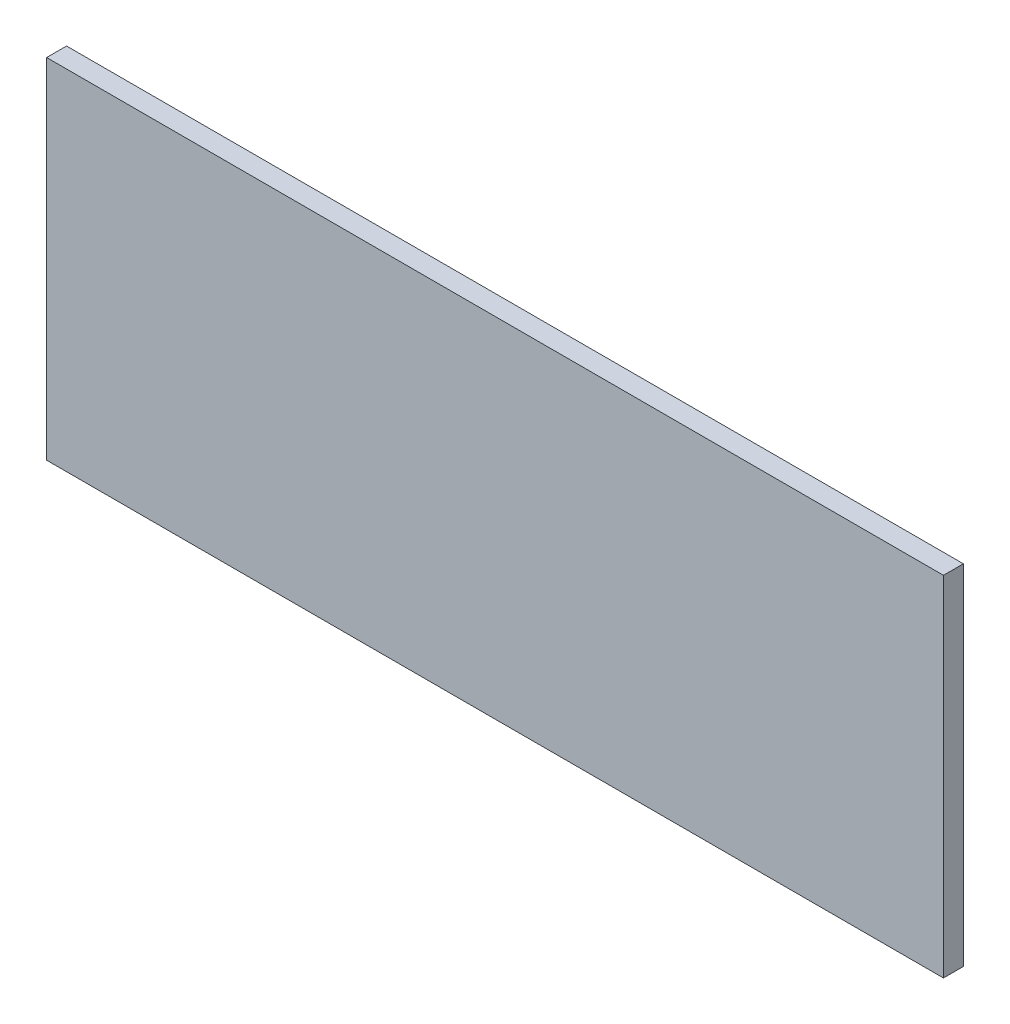
ISO-10303-21;
HEADER;
FILE_DESCRIPTION(('STEP AP214'),'2;1');
FILE_NAME('part.step','',(''),(''),'','','');
FILE_SCHEMA(('AUTOMOTIVE_DESIGN { 1 0 10303 214 1 1 1 1 }'));
ENDSEC;
DATA;
#1=APPLICATION_CONTEXT('core data for automotive mechanical design processes');
#2=APPLICATION_PROTOCOL_DEFINITION('international standard','automotive_design',2000,#1);
#3=PRODUCT_CONTEXT('',#1,'mechanical');
#4=PRODUCT('Part','Part','',(#3));
#5=PRODUCT_RELATED_PRODUCT_CATEGORY('part','',(#4));
#6=PRODUCT_DEFINITION_FORMATION('','',#4);
#7=PRODUCT_DEFINITION_CONTEXT('part definition',#1,'design');
#8=PRODUCT_DEFINITION('design','',#6,#7);
#9=PRODUCT_DEFINITION_SHAPE('','',#8);
#10=(LENGTH_UNIT() NAMED_UNIT(*) SI_UNIT(.MILLI.,.METRE.));
#11=(NAMED_UNIT(*) PLANE_ANGLE_UNIT() SI_UNIT($,.RADIAN.));
#12=(NAMED_UNIT(*) SI_UNIT($,.STERADIAN.) SOLID_ANGLE_UNIT());
#13=UNCERTAINTY_MEASURE_WITH_UNIT(LENGTH_MEASURE(1.E-05),#10,'distance_accuracy_value','');
#14=(GEOMETRIC_REPRESENTATION_CONTEXT(3) GLOBAL_UNCERTAINTY_ASSIGNED_CONTEXT((#13)) GLOBAL_UNIT_ASSIGNED_CONTEXT((#10,
#11,#12)) REPRESENTATION_CONTEXT('',''));
#15=CARTESIAN_POINT('',(0.,0.,0.));
#16=DIRECTION('',(0.,0.,1.));
#17=DIRECTION('',(1.,0.,0.));
#18=AXIS2_PLACEMENT_3D('',#15,#16,#17);
#19=CARTESIAN_POINT('',(90.,35.,4.));
#20=DIRECTION('',(-1.,0.,0.));
#21=DIRECTION('',(0.,0.,1.));
#22=AXIS2_PLACEMENT_3D('',#19,#20,#21);
#23=PLANE('',#22);
#24=DIRECTION('',(0.,1.,0.));
#25=VECTOR('',#24,1.);
#26=CARTESIAN_POINT('',(90.,35.,0.));
#27=LINE('',#26,#25);
#28=CARTESIAN_POINT('',(90.,-35.,0.));
#29=VERTEX_POINT('',#28);
#30=CARTESIAN_POINT('',(90.,35.,0.));
#31=VERTEX_POINT('',#30);
#32=EDGE_CURVE('E96',#29,#31,#27,.T.);
#33=ORIENTED_EDGE('',*,*,#32,.T.);
#34=DIRECTION('',(0.,0.,-1.));
#35=VECTOR('',#34,1.);
#36=CARTESIAN_POINT('',(90.,35.,4.));
#37=LINE('',#36,#35);
#38=CARTESIAN_POINT('',(90.,35.,4.));
#39=VERTEX_POINT('',#38);
#40=EDGE_CURVE('E11',#39,#31,#37,.T.);
#41=ORIENTED_EDGE('',*,*,#40,.F.);
#42=DIRECTION('',(0.,1.,0.));
#43=VECTOR('',#42,1.);
#44=CARTESIAN_POINT('',(90.,35.,4.));
#45=LINE('',#44,#43);
#46=CARTESIAN_POINT('',(90.,-35.,4.));
#47=VERTEX_POINT('',#46);
#48=EDGE_CURVE('E84',#47,#39,#45,.T.);
#49=ORIENTED_EDGE('',*,*,#48,.F.);
#50=DIRECTION('',(0.,0.,-1.));
#51=VECTOR('',#50,1.);
#52=CARTESIAN_POINT('',(90.,-35.,4.));
#53=LINE('',#52,#51);
#54=EDGE_CURVE('E92',#47,#29,#53,.T.);
#55=ORIENTED_EDGE('',*,*,#54,.T.);
#56=EDGE_LOOP('',(#33,#41,#49,#55));
#57=FACE_BOUND('',#56,.T.);
#58=ADVANCED_FACE('F33',(#57),#23,.F.);
#59=CARTESIAN_POINT('',(-90.,35.,4.));
#60=DIRECTION('',(0.,-1.,0.));
#61=DIRECTION('',(0.,0.,-1.));
#62=AXIS2_PLACEMENT_3D('',#59,#60,#61);
#63=PLANE('',#62);
#64=DIRECTION('',(-1.,0.,0.));
#65=VECTOR('',#64,1.);
#66=CARTESIAN_POINT('',(-90.,35.,0.));
#67=LINE('',#66,#65);
#68=CARTESIAN_POINT('',(-90.,35.,0.));
#69=VERTEX_POINT('',#68);
#70=EDGE_CURVE('E88',#31,#69,#67,.T.);
#71=ORIENTED_EDGE('',*,*,#70,.T.);
#72=DIRECTION('',(0.,0.,-1.));
#73=VECTOR('',#72,1.);
#74=CARTESIAN_POINT('',(-90.,35.,4.));
#75=LINE('',#74,#73);
#76=CARTESIAN_POINT('',(-90.,35.,4.));
#77=VERTEX_POINT('',#76);
#78=EDGE_CURVE('E41',#77,#69,#75,.T.);
#79=ORIENTED_EDGE('',*,*,#78,.F.);
#80=DIRECTION('',(-1.,0.,0.));
#81=VECTOR('',#80,1.);
#82=CARTESIAN_POINT('',(-90.,35.,4.));
#83=LINE('',#82,#81);
#84=EDGE_CURVE('E79',#39,#77,#83,.T.);
#85=ORIENTED_EDGE('',*,*,#84,.F.);
#86=ORIENTED_EDGE('',*,*,#40,.T.);
#87=EDGE_LOOP('',(#71,#79,#85,#86));
#88=FACE_BOUND('',#87,.T.);
#89=ADVANCED_FACE('F87',(#88),#63,.F.);
#90=CARTESIAN_POINT('',(-90.,35.,4.));
#91=DIRECTION('',(1.,0.,0.));
#92=DIRECTION('',(0.,0.,-1.));
#93=AXIS2_PLACEMENT_3D('',#90,#91,#92);
#94=PLANE('',#93);
#95=DIRECTION('',(0.,-1.,0.));
#96=VECTOR('',#95,1.);
#97=CARTESIAN_POINT('',(-90.,35.,0.));
#98=LINE('',#97,#96);
#99=CARTESIAN_POINT('',(-90.,-35.,0.));
#100=VERTEX_POINT('',#99);
#101=EDGE_CURVE('E66',#69,#100,#98,.T.);
#102=ORIENTED_EDGE('',*,*,#101,.T.);
#103=DIRECTION('',(0.,0.,-1.));
#104=VECTOR('',#103,1.);
#105=CARTESIAN_POINT('',(-90.,-35.,4.));
#106=LINE('',#105,#104);
#107=CARTESIAN_POINT('',(-90.,-35.,4.));
#108=VERTEX_POINT('',#107);
#109=EDGE_CURVE('E89',#108,#100,#106,.T.);
#110=ORIENTED_EDGE('',*,*,#109,.F.);
#111=DIRECTION('',(0.,-1.,0.));
#112=VECTOR('',#111,1.);
#113=CARTESIAN_POINT('',(-90.,35.,4.));
#114=LINE('',#113,#112);
#115=EDGE_CURVE('E82',#77,#108,#114,.T.);
#116=ORIENTED_EDGE('',*,*,#115,.F.);
#117=ORIENTED_EDGE('',*,*,#78,.T.);
#118=EDGE_LOOP('',(#102,#110,#116,#117));
#119=FACE_BOUND('',#118,.T.);
#120=ADVANCED_FACE('F90',(#119),#94,.F.);
#121=CARTESIAN_POINT('',(-90.,-35.,4.));
#122=DIRECTION('',(0.,1.,0.));
#123=DIRECTION('',(0.,0.,1.));
#124=AXIS2_PLACEMENT_3D('',#121,#122,#123);
#125=PLANE('',#124);
#126=DIRECTION('',(1.,0.,0.));
#127=VECTOR('',#126,1.);
#128=CARTESIAN_POINT('',(-90.,-35.,0.));
#129=LINE('',#128,#127);
#130=EDGE_CURVE('E72',#100,#29,#129,.T.);
#131=ORIENTED_EDGE('',*,*,#130,.T.);
#132=ORIENTED_EDGE('',*,*,#54,.F.);
#133=DIRECTION('',(1.,0.,0.));
#134=VECTOR('',#133,1.);
#135=CARTESIAN_POINT('',(-90.,-35.,4.));
#136=LINE('',#135,#134);
#137=EDGE_CURVE('E49',#108,#47,#136,.T.);
#138=ORIENTED_EDGE('',*,*,#137,.F.);
#139=ORIENTED_EDGE('',*,*,#109,.T.);
#140=EDGE_LOOP('',(#131,#132,#138,#139));
#141=FACE_BOUND('',#140,.T.);
#142=ADVANCED_FACE('F103',(#141),#125,.F.);
#143=CARTESIAN_POINT('',(0.,0.,4.));
#144=DIRECTION('',(0.,0.,1.));
#145=DIRECTION('',(1.,0.,0.));
#146=AXIS2_PLACEMENT_3D('',#143,#144,#145);
#147=PLANE('',#146);
#148=ORIENTED_EDGE('',*,*,#48,.T.);
#149=ORIENTED_EDGE('',*,*,#84,.T.);
#150=ORIENTED_EDGE('',*,*,#115,.T.);
#151=ORIENTED_EDGE('',*,*,#137,.T.);
#152=EDGE_LOOP('',(#148,#149,#150,#151));
#153=FACE_BOUND('',#152,.T.);
#154=ADVANCED_FACE('F80',(#153),#147,.T.);
#155=CARTESIAN_POINT('',(0.,0.,0.));
#156=DIRECTION('',(0.,0.,1.));
#157=DIRECTION('',(1.,0.,0.));
#158=AXIS2_PLACEMENT_3D('',#155,#156,#157);
#159=PLANE('',#158);
#160=ORIENTED_EDGE('',*,*,#32,.F.);
#161=ORIENTED_EDGE('',*,*,#130,.F.);
#162=ORIENTED_EDGE('',*,*,#101,.F.);
#163=ORIENTED_EDGE('',*,*,#70,.F.);
#164=EDGE_LOOP('',(#160,#161,#162,#163));
#165=FACE_BOUND('',#164,.T.);
#166=ADVANCED_FACE('F106',(#165),#159,.F.);
#167=CLOSED_SHELL('',(#58,#89,#120,#142,#154,#166));
#168=MANIFOLD_SOLID_BREP('B2',#167);
#169=ADVANCED_BREP_SHAPE_REPRESENTATION('',(#18,#168),#14);
#170=SHAPE_DEFINITION_REPRESENTATION(#9,#169);
ENDSEC;
END-ISO-10303-21;
